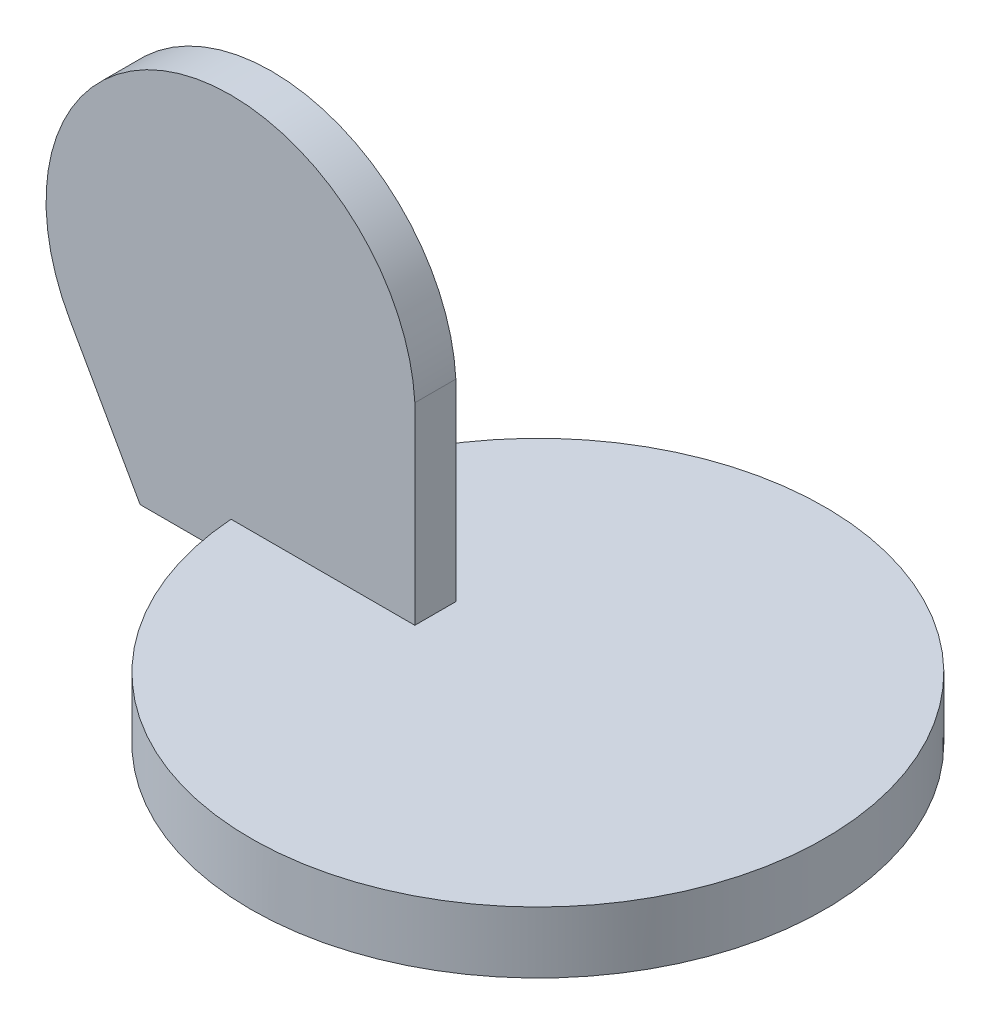
ISO-10303-21;
HEADER;
FILE_DESCRIPTION(('STEP AP214'),'2;1');
FILE_NAME('part.step','',(''),(''),'','','');
FILE_SCHEMA(('AUTOMOTIVE_DESIGN { 1 0 10303 214 1 1 1 1 }'));
ENDSEC;
DATA;
#1=APPLICATION_CONTEXT('core data for automotive mechanical design processes');
#2=APPLICATION_PROTOCOL_DEFINITION('international standard','automotive_design',2000,#1);
#3=PRODUCT_CONTEXT('',#1,'mechanical');
#4=PRODUCT('Part','Part','',(#3));
#5=PRODUCT_RELATED_PRODUCT_CATEGORY('part','',(#4));
#6=PRODUCT_DEFINITION_FORMATION('','',#4);
#7=PRODUCT_DEFINITION_CONTEXT('part definition',#1,'design');
#8=PRODUCT_DEFINITION('design','',#6,#7);
#9=PRODUCT_DEFINITION_SHAPE('','',#8);
#10=(LENGTH_UNIT() NAMED_UNIT(*) SI_UNIT(.MILLI.,.METRE.));
#11=(NAMED_UNIT(*) PLANE_ANGLE_UNIT() SI_UNIT($,.RADIAN.));
#12=(NAMED_UNIT(*) SI_UNIT($,.STERADIAN.) SOLID_ANGLE_UNIT());
#13=UNCERTAINTY_MEASURE_WITH_UNIT(LENGTH_MEASURE(1.E-05),#10,'distance_accuracy_value','');
#14=(GEOMETRIC_REPRESENTATION_CONTEXT(3) GLOBAL_UNCERTAINTY_ASSIGNED_CONTEXT((#13)) GLOBAL_UNIT_ASSIGNED_CONTEXT((#10,
#11,#12)) REPRESENTATION_CONTEXT('',''));
#15=CARTESIAN_POINT('',(0.,0.,0.));
#16=DIRECTION('',(0.,0.,1.));
#17=DIRECTION('',(1.,0.,0.));
#18=AXIS2_PLACEMENT_3D('',#15,#16,#17);
#19=CARTESIAN_POINT('',(0.,15.,0.));
#20=DIRECTION('',(0.,-1.,0.));
#21=DIRECTION('',(0.,0.,-1.));
#22=AXIS2_PLACEMENT_3D('',#19,#20,#21);
#23=CYLINDRICAL_SURFACE('',#22,70.);
#24=CARTESIAN_POINT('',(0.,0.,0.));
#25=DIRECTION('',(0.,1.,0.));
#26=DIRECTION('',(0.,0.,1.));
#27=AXIS2_PLACEMENT_3D('',#24,#25,#26);
#28=CIRCLE('',#27,70.);
#29=CARTESIAN_POINT('',(0.,0.,70.));
#30=VERTEX_POINT('',#29);
#31=EDGE_CURVE('E151',#30,#30,#28,.T.);
#32=ORIENTED_EDGE('',*,*,#31,.T.);
#33=EDGE_LOOP('',(#32));
#34=FACE_BOUND('',#33,.T.);
#35=DIRECTION('',(0.,-1.,0.));
#36=VECTOR('',#35,1.);
#37=CARTESIAN_POINT('',(-69.8212002188447,15.,5.));
#38=LINE('',#37,#36);
#39=CARTESIAN_POINT('',(-69.8212002188447,6.99999999999999,5.));
#40=VERTEX_POINT('',#39);
#41=CARTESIAN_POINT('',(-69.8212002188447,15.,5.));
#42=VERTEX_POINT('',#41);
#43=EDGE_CURVE('E53',#40,#42,#38,.F.);
#44=ORIENTED_EDGE('',*,*,#43,.F.);
#45=CARTESIAN_POINT('',(0.,7.,0.));
#46=DIRECTION('',(0.,-1.,0.));
#47=DIRECTION('',(1.,0.,0.));
#48=AXIS2_PLACEMENT_3D('',#45,#46,#47);
#49=CIRCLE('',#48,70.);
#50=CARTESIAN_POINT('',(-69.8212002188447,6.99999999999999,-5.));
#51=VERTEX_POINT('',#50);
#52=EDGE_CURVE('E11',#40,#51,#49,.T.);
#53=ORIENTED_EDGE('',*,*,#52,.T.);
#54=DIRECTION('',(0.,-1.,0.));
#55=VECTOR('',#54,1.);
#56=CARTESIAN_POINT('',(-69.8212002188447,15.,-5.));
#57=LINE('',#56,#55);
#58=CARTESIAN_POINT('',(-69.8212002188447,15.,-5.));
#59=VERTEX_POINT('',#58);
#60=EDGE_CURVE('E140',#51,#59,#57,.F.);
#61=ORIENTED_EDGE('',*,*,#60,.T.);
#62=CARTESIAN_POINT('',(0.,15.,0.));
#63=DIRECTION('',(0.,1.,0.));
#64=DIRECTION('',(0.,0.,1.));
#65=AXIS2_PLACEMENT_3D('',#62,#63,#64);
#66=CIRCLE('',#65,70.);
#67=EDGE_CURVE('E157',#42,#59,#66,.T.);
#68=ORIENTED_EDGE('',*,*,#67,.F.);
#69=EDGE_LOOP('',(#44,#53,#61,#68));
#70=FACE_BOUND('',#69,.T.);
#71=ADVANCED_FACE('F39',(#34,#70),#23,.T.);
#72=CARTESIAN_POINT('',(0.,15.,0.));
#73=DIRECTION('',(0.,1.,0.));
#74=DIRECTION('',(0.,0.,1.));
#75=AXIS2_PLACEMENT_3D('',#72,#73,#74);
#76=PLANE('',#75);
#77=DIRECTION('',(0.,0.,-1.));
#78=VECTOR('',#77,1.);
#79=CARTESIAN_POINT('',(-25.,15.,0.));
#80=LINE('',#79,#78);
#81=CARTESIAN_POINT('',(-25.,15.,5.));
#82=VERTEX_POINT('',#81);
#83=CARTESIAN_POINT('',(-25.,15.,-5.));
#84=VERTEX_POINT('',#83);
#85=EDGE_CURVE('E166',#82,#84,#80,.T.);
#86=ORIENTED_EDGE('',*,*,#85,.F.);
#87=DIRECTION('',(-1.,0.,0.));
#88=VECTOR('',#87,1.);
#89=CARTESIAN_POINT('',(0.,15.,5.));
#90=LINE('',#89,#88);
#91=EDGE_CURVE('E47',#82,#42,#90,.T.);
#92=ORIENTED_EDGE('',*,*,#91,.T.);
#93=ORIENTED_EDGE('',*,*,#67,.T.);
#94=DIRECTION('',(-1.,0.,0.));
#95=VECTOR('',#94,1.);
#96=CARTESIAN_POINT('',(0.,15.,-5.));
#97=LINE('',#96,#95);
#98=EDGE_CURVE('E156',#84,#59,#97,.T.);
#99=ORIENTED_EDGE('',*,*,#98,.F.);
#100=EDGE_LOOP('',(#86,#92,#93,#99));
#101=FACE_BOUND('',#100,.T.);
#102=ADVANCED_FACE('F171',(#101),#76,.T.);
#103=CARTESIAN_POINT('',(0.,0.,0.));
#104=DIRECTION('',(0.,1.,0.));
#105=DIRECTION('',(0.,0.,1.));
#106=AXIS2_PLACEMENT_3D('',#103,#104,#105);
#107=PLANE('',#106);
#108=CARTESIAN_POINT('',(0.,0.,0.));
#109=DIRECTION('',(0.,-1.,0.));
#110=DIRECTION('',(0.,0.,-1.));
#111=AXIS2_PLACEMENT_3D('',#108,#109,#110);
#112=CIRCLE('',#111,65.);
#113=CARTESIAN_POINT('',(0.,0.,-65.));
#114=VERTEX_POINT('',#113);
#115=EDGE_CURVE('E152',#114,#114,#112,.T.);
#116=ORIENTED_EDGE('',*,*,#115,.F.);
#117=EDGE_LOOP('',(#116));
#118=FACE_BOUND('',#117,.T.);
#119=ORIENTED_EDGE('',*,*,#31,.F.);
#120=EDGE_LOOP('',(#119));
#121=FACE_BOUND('',#120,.T.);
#122=ADVANCED_FACE('F193',(#118,#121),#107,.F.);
#123=CARTESIAN_POINT('',(0.,-3.,0.));
#124=DIRECTION('',(0.,1.,0.));
#125=DIRECTION('',(0.,0.,1.));
#126=AXIS2_PLACEMENT_3D('',#123,#124,#125);
#127=CYLINDRICAL_SURFACE('',#126,65.);
#128=CARTESIAN_POINT('',(0.,-3.,0.));
#129=DIRECTION('',(0.,-1.,0.));
#130=DIRECTION('',(0.,0.,-1.));
#131=AXIS2_PLACEMENT_3D('',#128,#129,#130);
#132=CIRCLE('',#131,65.);
#133=CARTESIAN_POINT('',(0.,-3.,-65.));
#134=VERTEX_POINT('',#133);
#135=EDGE_CURVE('E147',#134,#134,#132,.T.);
#136=ORIENTED_EDGE('',*,*,#135,.F.);
#137=EDGE_LOOP('',(#136));
#138=FACE_BOUND('',#137,.T.);
#139=ORIENTED_EDGE('',*,*,#115,.T.);
#140=EDGE_LOOP('',(#139));
#141=FACE_BOUND('',#140,.T.);
#142=ADVANCED_FACE('F198',(#138,#141),#127,.T.);
#143=CARTESIAN_POINT('',(0.,-3.,0.));
#144=DIRECTION('',(0.,-1.,0.));
#145=DIRECTION('',(0.,0.,-1.));
#146=AXIS2_PLACEMENT_3D('',#143,#144,#145);
#147=PLANE('',#146);
#148=ORIENTED_EDGE('',*,*,#135,.T.);
#149=EDGE_LOOP('',(#148));
#150=FACE_BOUND('',#149,.T.);
#151=ADVANCED_FACE('F203',(#150),#147,.T.);
#152=CARTESIAN_POINT('',(-69.9340796398505,59.5651515612724,5.));
#153=DIRECTION('',(0.,0.,-1.));
#154=DIRECTION('',(-1.,0.,0.));
#155=AXIS2_PLACEMENT_3D('',#152,#153,#154);
#156=PLANE('',#155);
#157=DIRECTION('',(-1.,0.,0.));
#158=VECTOR('',#157,1.);
#159=CARTESIAN_POINT('',(-25.,6.99999999999999,5.));
#160=LINE('',#159,#158);
#161=CARTESIAN_POINT('',(-92.,6.99999999999999,5.));
#162=VERTEX_POINT('',#161);
#163=EDGE_CURVE('E102',#40,#162,#160,.T.);
#164=ORIENTED_EDGE('',*,*,#163,.F.);
#165=ORIENTED_EDGE('',*,*,#43,.T.);
#166=ORIENTED_EDGE('',*,*,#91,.F.);
#167=DIRECTION('',(0.,-1.,0.));
#168=VECTOR('',#167,1.);
#169=CARTESIAN_POINT('',(-25.,62.,5.));
#170=LINE('',#169,#168);
#171=CARTESIAN_POINT('',(-25.,62.,5.));
#172=VERTEX_POINT('',#171);
#173=EDGE_CURVE('E112',#172,#82,#170,.T.);
#174=ORIENTED_EDGE('',*,*,#173,.F.);
#175=CARTESIAN_POINT('',(-69.9340796398505,59.5651515612724,5.));
#176=DIRECTION('',(0.,0.,-1.));
#177=DIRECTION('',(-1.,0.,0.));
#178=AXIS2_PLACEMENT_3D('',#175,#176,#177);
#179=CIRCLE('',#178,45.);
#180=CARTESIAN_POINT('',(-109.156726543945,37.506503147629,5.));
#181=VERTEX_POINT('',#180);
#182=EDGE_CURVE('E93',#181,#172,#179,.T.);
#183=ORIENTED_EDGE('',*,*,#182,.F.);
#184=DIRECTION('',(-0.490192186969854,0.871614375646542,0.));
#185=VECTOR('',#184,1.);
#186=CARTESIAN_POINT('',(-92.,6.99999999999999,5.));
#187=LINE('',#186,#185);
#188=EDGE_CURVE('E109',#162,#181,#187,.T.);
#189=ORIENTED_EDGE('',*,*,#188,.F.);
#190=EDGE_LOOP('',(#164,#165,#166,#174,#183,#189));
#191=FACE_BOUND('',#190,.T.);
#192=ADVANCED_FACE('F108',(#191),#156,.F.);
#193=CARTESIAN_POINT('',(-69.9340796398505,59.5651515612724,-5.));
#194=DIRECTION('',(0.,0.,-1.));
#195=DIRECTION('',(-1.,0.,0.));
#196=AXIS2_PLACEMENT_3D('',#193,#194,#195);
#197=PLANE('',#196);
#198=ORIENTED_EDGE('',*,*,#60,.F.);
#199=DIRECTION('',(-1.,0.,0.));
#200=VECTOR('',#199,1.);
#201=CARTESIAN_POINT('',(-25.,6.99999999999999,-5.));
#202=LINE('',#201,#200);
#203=CARTESIAN_POINT('',(-92.,6.99999999999999,-5.));
#204=VERTEX_POINT('',#203);
#205=EDGE_CURVE('E120',#51,#204,#202,.T.);
#206=ORIENTED_EDGE('',*,*,#205,.T.);
#207=DIRECTION('',(-0.490192186969854,0.871614375646542,0.));
#208=VECTOR('',#207,1.);
#209=CARTESIAN_POINT('',(-92.,6.99999999999999,-5.));
#210=LINE('',#209,#208);
#211=CARTESIAN_POINT('',(-109.156726543945,37.506503147629,-5.));
#212=VERTEX_POINT('',#211);
#213=EDGE_CURVE('E130',#204,#212,#210,.T.);
#214=ORIENTED_EDGE('',*,*,#213,.T.);
#215=CARTESIAN_POINT('',(-69.9340796398505,59.5651515612724,-5.));
#216=DIRECTION('',(0.,0.,-1.));
#217=DIRECTION('',(-1.,0.,0.));
#218=AXIS2_PLACEMENT_3D('',#215,#216,#217);
#219=CIRCLE('',#218,45.);
#220=CARTESIAN_POINT('',(-25.,62.,-5.));
#221=VERTEX_POINT('',#220);
#222=EDGE_CURVE('E95',#212,#221,#219,.T.);
#223=ORIENTED_EDGE('',*,*,#222,.T.);
#224=DIRECTION('',(0.,-1.,0.));
#225=VECTOR('',#224,1.);
#226=CARTESIAN_POINT('',(-25.,62.,-5.));
#227=LINE('',#226,#225);
#228=EDGE_CURVE('E123',#221,#84,#227,.T.);
#229=ORIENTED_EDGE('',*,*,#228,.T.);
#230=ORIENTED_EDGE('',*,*,#98,.T.);
#231=EDGE_LOOP('',(#198,#206,#214,#223,#229,#230));
#232=FACE_BOUND('',#231,.T.);
#233=ADVANCED_FACE('F176',(#232),#197,.T.);
#234=CARTESIAN_POINT('',(-92.,6.99999999999999,5.));
#235=DIRECTION('',(-0.871614375646542,-0.490192186969854,0.));
#236=DIRECTION('',(0.490192186969854,-0.871614375646542,0.));
#237=AXIS2_PLACEMENT_3D('',#234,#235,#236);
#238=PLANE('',#237);
#239=ORIENTED_EDGE('',*,*,#213,.F.);
#240=DIRECTION('',(0.,0.,-1.));
#241=VECTOR('',#240,1.);
#242=CARTESIAN_POINT('',(-92.,6.99999999999999,5.));
#243=LINE('',#242,#241);
#244=EDGE_CURVE('E118',#162,#204,#243,.T.);
#245=ORIENTED_EDGE('',*,*,#244,.F.);
#246=ORIENTED_EDGE('',*,*,#188,.T.);
#247=DIRECTION('',(0.,0.,-1.));
#248=VECTOR('',#247,1.);
#249=CARTESIAN_POINT('',(-109.156726543945,37.506503147629,5.));
#250=LINE('',#249,#248);
#251=EDGE_CURVE('E90',#181,#212,#250,.T.);
#252=ORIENTED_EDGE('',*,*,#251,.T.);
#253=EDGE_LOOP('',(#239,#245,#246,#252));
#254=FACE_BOUND('',#253,.T.);
#255=ADVANCED_FACE('F116',(#254),#238,.T.);
#256=CARTESIAN_POINT('',(-25.,6.99999999999999,5.));
#257=DIRECTION('',(0.,-1.,0.));
#258=DIRECTION('',(1.,0.,0.));
#259=AXIS2_PLACEMENT_3D('',#256,#257,#258);
#260=PLANE('',#259);
#261=ORIENTED_EDGE('',*,*,#52,.F.);
#262=ORIENTED_EDGE('',*,*,#163,.T.);
#263=ORIENTED_EDGE('',*,*,#244,.T.);
#264=ORIENTED_EDGE('',*,*,#205,.F.);
#265=EDGE_LOOP('',(#261,#262,#263,#264));
#266=FACE_BOUND('',#265,.T.);
#267=ADVANCED_FACE('F173',(#266),#260,.T.);
#268=CARTESIAN_POINT('',(-25.,62.,5.));
#269=DIRECTION('',(1.,0.,0.));
#270=DIRECTION('',(0.,1.,0.));
#271=AXIS2_PLACEMENT_3D('',#268,#269,#270);
#272=PLANE('',#271);
#273=ORIENTED_EDGE('',*,*,#173,.T.);
#274=ORIENTED_EDGE('',*,*,#85,.T.);
#275=ORIENTED_EDGE('',*,*,#228,.F.);
#276=DIRECTION('',(0.,0.,-1.));
#277=VECTOR('',#276,1.);
#278=CARTESIAN_POINT('',(-25.,62.,5.));
#279=LINE('',#278,#277);
#280=EDGE_CURVE('E101',#172,#221,#279,.T.);
#281=ORIENTED_EDGE('',*,*,#280,.F.);
#282=EDGE_LOOP('',(#273,#274,#275,#281));
#283=FACE_BOUND('',#282,.T.);
#284=ADVANCED_FACE('F179',(#283),#272,.T.);
#285=CARTESIAN_POINT('',(-69.9340796398505,59.5651515612724,5.));
#286=DIRECTION('',(0.,0.,-1.));
#287=DIRECTION('',(-1.,0.,0.));
#288=AXIS2_PLACEMENT_3D('',#285,#286,#287);
#289=CYLINDRICAL_SURFACE('',#288,45.);
#290=ORIENTED_EDGE('',*,*,#222,.F.);
#291=ORIENTED_EDGE('',*,*,#251,.F.);
#292=ORIENTED_EDGE('',*,*,#182,.T.);
#293=ORIENTED_EDGE('',*,*,#280,.T.);
#294=EDGE_LOOP('',(#290,#291,#292,#293));
#295=FACE_BOUND('',#294,.T.);
#296=ADVANCED_FACE('F92',(#295),#289,.T.);
#297=CLOSED_SHELL('',(#71,#102,#122,#142,#151,#192,#233,#255,#267,#284,#296));
#298=MANIFOLD_SOLID_BREP('B2',#297);
#299=ADVANCED_BREP_SHAPE_REPRESENTATION('',(#18,#298),#14);
#300=SHAPE_DEFINITION_REPRESENTATION(#9,#299);
ENDSEC;
END-ISO-10303-21;
